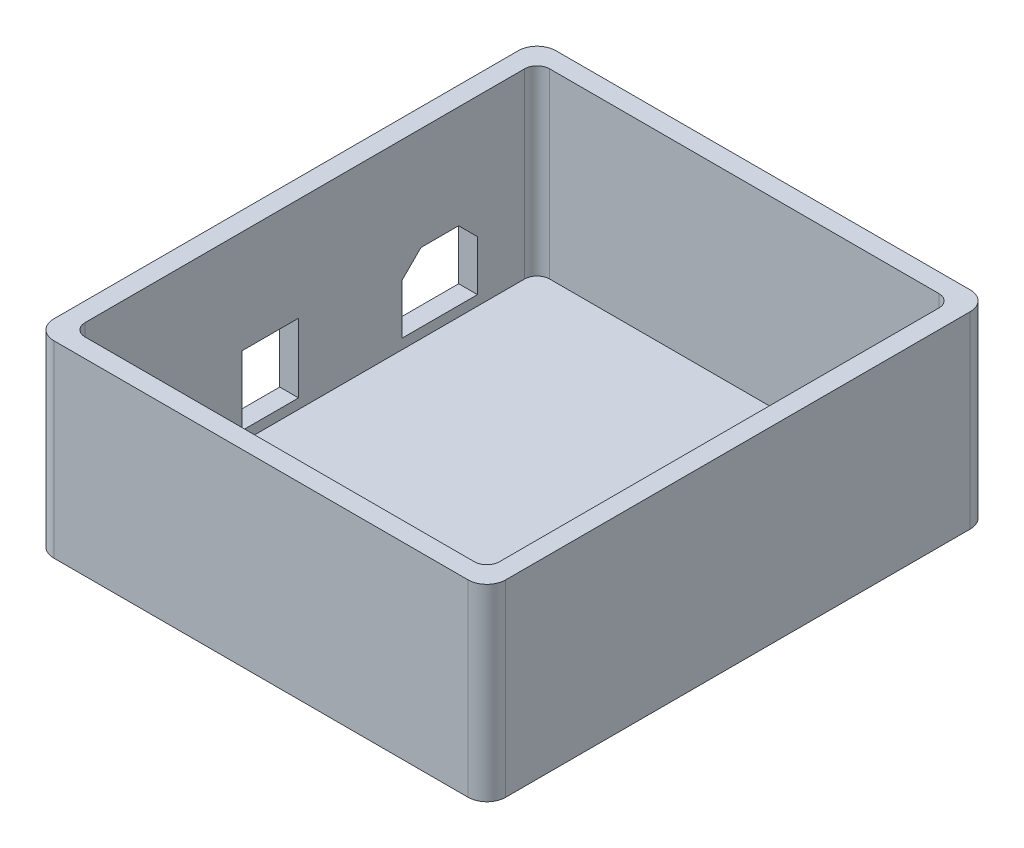
ISO-10303-21;
HEADER;
FILE_DESCRIPTION(('STEP AP214'),'2;1');
FILE_NAME('part.step','',(''),(''),'','','');
FILE_SCHEMA(('AUTOMOTIVE_DESIGN { 1 0 10303 214 1 1 1 1 }'));
ENDSEC;
DATA;
#1=APPLICATION_CONTEXT('core data for automotive mechanical design processes');
#2=APPLICATION_PROTOCOL_DEFINITION('international standard','automotive_design',2000,#1);
#3=PRODUCT_CONTEXT('',#1,'mechanical');
#4=PRODUCT('Part','Part','',(#3));
#5=PRODUCT_RELATED_PRODUCT_CATEGORY('part','',(#4));
#6=PRODUCT_DEFINITION_FORMATION('','',#4);
#7=PRODUCT_DEFINITION_CONTEXT('part definition',#1,'design');
#8=PRODUCT_DEFINITION('design','',#6,#7);
#9=PRODUCT_DEFINITION_SHAPE('','',#8);
#10=(LENGTH_UNIT() NAMED_UNIT(*) SI_UNIT(.MILLI.,.METRE.));
#11=(NAMED_UNIT(*) PLANE_ANGLE_UNIT() SI_UNIT($,.RADIAN.));
#12=(NAMED_UNIT(*) SI_UNIT($,.STERADIAN.) SOLID_ANGLE_UNIT());
#13=UNCERTAINTY_MEASURE_WITH_UNIT(LENGTH_MEASURE(1.E-05),#10,'distance_accuracy_value','');
#14=(GEOMETRIC_REPRESENTATION_CONTEXT(3) GLOBAL_UNCERTAINTY_ASSIGNED_CONTEXT((#13)) GLOBAL_UNIT_ASSIGNED_CONTEXT((#10,
#11,#12)) REPRESENTATION_CONTEXT('',''));
#15=CARTESIAN_POINT('',(0.,0.,0.));
#16=DIRECTION('',(0.,0.,1.));
#17=DIRECTION('',(1.,0.,0.));
#18=AXIS2_PLACEMENT_3D('',#15,#16,#17);
#19=CARTESIAN_POINT('',(-39.9773371104816,30.,-25.5552407932011));
#20=DIRECTION('',(1.,0.,0.));
#21=DIRECTION('',(0.,0.,-1.));
#22=AXIS2_PLACEMENT_3D('',#19,#20,#21);
#23=PLANE('',#22);
#24=DIRECTION('',(0.,-1.,0.));
#25=VECTOR('',#24,1.);
#26=CARTESIAN_POINT('',(-39.9773371104816,10.6,-16.0552407932011));
#27=LINE('',#26,#25);
#28=CARTESIAN_POINT('',(-39.9773371104816,10.6,-16.0552407932011));
#29=VERTEX_POINT('',#28);
#30=CARTESIAN_POINT('',(-39.9773371104816,2.6,-16.0552407932011));
#31=VERTEX_POINT('',#30);
#32=EDGE_CURVE('E244',#29,#31,#27,.T.);
#33=ORIENTED_EDGE('',*,*,#32,.F.);
#34=DIRECTION('',(0.,-0.706666118115189,-0.707547169811321));
#35=VECTOR('',#34,1.);
#36=CARTESIAN_POINT('',(-39.9773371104816,13.5962643408084,-13.0552407932011));
#37=LINE('',#36,#35);
#38=CARTESIAN_POINT('',(-39.9773371104816,13.5962643408084,-13.0552407932011));
#39=VERTEX_POINT('',#38);
#40=EDGE_CURVE('E50',#39,#29,#37,.T.);
#41=ORIENTED_EDGE('',*,*,#40,.F.);
#42=DIRECTION('',(0.,0.,-1.));
#43=VECTOR('',#42,1.);
#44=CARTESIAN_POINT('',(-39.9773371104816,13.5962643408084,-7.05524079320111));
#45=LINE('',#44,#43);
#46=CARTESIAN_POINT('',(-39.9773371104816,13.5962643408084,-7.05524079320111));
#47=VERTEX_POINT('',#46);
#48=EDGE_CURVE('E230',#47,#39,#45,.T.);
#49=ORIENTED_EDGE('',*,*,#48,.F.);
#50=DIRECTION('',(0.,0.706666118115189,-0.707547169811321));
#51=VECTOR('',#50,1.);
#52=CARTESIAN_POINT('',(-39.9773371104816,10.6,-4.05524079320111));
#53=LINE('',#52,#51);
#54=CARTESIAN_POINT('',(-39.9773371104816,10.6,-4.05524079320111));
#55=VERTEX_POINT('',#54);
#56=EDGE_CURVE('E233',#55,#47,#53,.T.);
#57=ORIENTED_EDGE('',*,*,#56,.F.);
#58=DIRECTION('',(0.,1.,0.));
#59=VECTOR('',#58,1.);
#60=CARTESIAN_POINT('',(-39.9773371104816,2.6,-4.05524079320111));
#61=LINE('',#60,#59);
#62=CARTESIAN_POINT('',(-39.9773371104816,2.6,-4.05524079320111));
#63=VERTEX_POINT('',#62);
#64=EDGE_CURVE('E250',#63,#55,#61,.T.);
#65=ORIENTED_EDGE('',*,*,#64,.F.);
#66=DIRECTION('',(0.,0.,1.));
#67=VECTOR('',#66,1.);
#68=CARTESIAN_POINT('',(-39.9773371104816,2.6,-16.0552407932011));
#69=LINE('',#68,#67);
#70=EDGE_CURVE('E247',#31,#63,#69,.T.);
#71=ORIENTED_EDGE('',*,*,#70,.F.);
#72=EDGE_LOOP('',(#33,#41,#49,#57,#65,#71));
#73=FACE_BOUND('',#72,.T.);
#74=DIRECTION('',(0.,0.,1.));
#75=VECTOR('',#74,1.);
#76=CARTESIAN_POINT('',(-39.9773371104816,2.6,12.4447592067989));
#77=LINE('',#76,#75);
#78=CARTESIAN_POINT('',(-39.9773371104816,2.6,12.4447592067989));
#79=VERTEX_POINT('',#78);
#80=CARTESIAN_POINT('',(-39.9773371104816,2.6,21.4447592067989));
#81=VERTEX_POINT('',#80);
#82=EDGE_CURVE('E280',#79,#81,#77,.T.);
#83=ORIENTED_EDGE('',*,*,#82,.F.);
#84=DIRECTION('',(0.,-1.,0.));
#85=VECTOR('',#84,1.);
#86=CARTESIAN_POINT('',(-39.9773371104816,13.6,12.4447592067989));
#87=LINE('',#86,#85);
#88=CARTESIAN_POINT('',(-39.9773371104816,13.6,12.4447592067989));
#89=VERTEX_POINT('',#88);
#90=EDGE_CURVE('E58',#89,#79,#87,.T.);
#91=ORIENTED_EDGE('',*,*,#90,.F.);
#92=DIRECTION('',(0.,0.,-1.));
#93=VECTOR('',#92,1.);
#94=CARTESIAN_POINT('',(-39.9773371104816,13.6,12.4447592067989));
#95=LINE('',#94,#93);
#96=CARTESIAN_POINT('',(-39.9773371104816,13.6,21.4447592067989));
#97=VERTEX_POINT('',#96);
#98=EDGE_CURVE('E269',#97,#89,#95,.T.);
#99=ORIENTED_EDGE('',*,*,#98,.F.);
#100=DIRECTION('',(0.,1.,0.));
#101=VECTOR('',#100,1.);
#102=CARTESIAN_POINT('',(-39.9773371104816,13.6,21.4447592067989));
#103=LINE('',#102,#101);
#104=EDGE_CURVE('E283',#81,#97,#103,.T.);
#105=ORIENTED_EDGE('',*,*,#104,.F.);
#106=EDGE_LOOP('',(#83,#91,#99,#105));
#107=FACE_BOUND('',#106,.T.);
#108=DIRECTION('',(0.,0.,1.));
#109=VECTOR('',#108,1.);
#110=CARTESIAN_POINT('',(-39.9773371104816,0.,-25.5552407932011));
#111=LINE('',#110,#109);
#112=CARTESIAN_POINT('',(-39.9773371104816,0.,-25.5552407932011));
#113=VERTEX_POINT('',#112);
#114=CARTESIAN_POINT('',(-39.9773371104816,0.,48.4447592067988));
#115=VERTEX_POINT('',#114);
#116=EDGE_CURVE('E362',#113,#115,#111,.T.);
#117=ORIENTED_EDGE('',*,*,#116,.T.);
#118=DIRECTION('',(0.,-1.,0.));
#119=VECTOR('',#118,1.);
#120=CARTESIAN_POINT('',(-39.9773371104816,30.,48.4447592067988));
#121=LINE('',#120,#119);
#122=CARTESIAN_POINT('',(-39.9773371104816,30.,48.4447592067988));
#123=VERTEX_POINT('',#122);
#124=EDGE_CURVE('E376',#123,#115,#121,.T.);
#125=ORIENTED_EDGE('',*,*,#124,.F.);
#126=DIRECTION('',(0.,0.,1.));
#127=VECTOR('',#126,1.);
#128=CARTESIAN_POINT('',(-39.9773371104816,30.,-25.5552407932011));
#129=LINE('',#128,#127);
#130=CARTESIAN_POINT('',(-39.9773371104816,30.,-25.5552407932011));
#131=VERTEX_POINT('',#130);
#132=EDGE_CURVE('E374',#131,#123,#129,.T.);
#133=ORIENTED_EDGE('',*,*,#132,.F.);
#134=DIRECTION('',(0.,-1.,0.));
#135=VECTOR('',#134,1.);
#136=CARTESIAN_POINT('',(-39.9773371104816,30.,-25.5552407932011));
#137=LINE('',#136,#135);
#138=EDGE_CURVE('E394',#131,#113,#137,.T.);
#139=ORIENTED_EDGE('',*,*,#138,.T.);
#140=EDGE_LOOP('',(#117,#125,#133,#139));
#141=FACE_BOUND('',#140,.T.);
#142=ADVANCED_FACE('F35',(#73,#107,#141),#23,.F.);
#143=CARTESIAN_POINT('',(-36.9773371104816,0.999999999999997,-23.5552407932011));
#144=DIRECTION('',(-1.,0.,0.));
#145=DIRECTION('',(0.,0.,1.));
#146=AXIS2_PLACEMENT_3D('',#143,#144,#145);
#147=PLANE('',#146);
#148=DIRECTION('',(0.,0.,-1.));
#149=VECTOR('',#148,1.);
#150=CARTESIAN_POINT('',(-36.9773371104816,13.5962643408084,-7.05524079320111));
#151=LINE('',#150,#149);
#152=CARTESIAN_POINT('',(-36.9773371104816,13.5962643408084,-7.05524079320111));
#153=VERTEX_POINT('',#152);
#154=CARTESIAN_POINT('',(-36.9773371104816,13.5962643408084,-13.0552407932011));
#155=VERTEX_POINT('',#154);
#156=EDGE_CURVE('E216',#153,#155,#151,.T.);
#157=ORIENTED_EDGE('',*,*,#156,.T.);
#158=DIRECTION('',(0.,-0.706666118115189,-0.707547169811321));
#159=VECTOR('',#158,1.);
#160=CARTESIAN_POINT('',(-36.9773371104816,13.5962643408084,-13.0552407932011));
#161=LINE('',#160,#159);
#162=CARTESIAN_POINT('',(-36.9773371104816,10.6,-16.0552407932011));
#163=VERTEX_POINT('',#162);
#164=EDGE_CURVE('E210',#155,#163,#161,.T.);
#165=ORIENTED_EDGE('',*,*,#164,.T.);
#166=DIRECTION('',(0.,-1.,0.));
#167=VECTOR('',#166,1.);
#168=CARTESIAN_POINT('',(-36.9773371104816,10.6,-16.0552407932011));
#169=LINE('',#168,#167);
#170=CARTESIAN_POINT('',(-36.9773371104816,2.6,-16.0552407932011));
#171=VERTEX_POINT('',#170);
#172=EDGE_CURVE('E220',#163,#171,#169,.T.);
#173=ORIENTED_EDGE('',*,*,#172,.T.);
#174=DIRECTION('',(0.,0.,1.));
#175=VECTOR('',#174,1.);
#176=CARTESIAN_POINT('',(-36.9773371104816,2.6,-16.0552407932011));
#177=LINE('',#176,#175);
#178=CARTESIAN_POINT('',(-36.9773371104816,2.6,-4.05524079320111));
#179=VERTEX_POINT('',#178);
#180=EDGE_CURVE('E224',#171,#179,#177,.T.);
#181=ORIENTED_EDGE('',*,*,#180,.T.);
#182=DIRECTION('',(0.,1.,0.));
#183=VECTOR('',#182,1.);
#184=CARTESIAN_POINT('',(-36.9773371104816,2.6,-4.05524079320111));
#185=LINE('',#184,#183);
#186=CARTESIAN_POINT('',(-36.9773371104816,10.6,-4.05524079320111));
#187=VERTEX_POINT('',#186);
#188=EDGE_CURVE('E237',#179,#187,#185,.T.);
#189=ORIENTED_EDGE('',*,*,#188,.T.);
#190=DIRECTION('',(0.,0.706666118115189,-0.707547169811321));
#191=VECTOR('',#190,1.);
#192=CARTESIAN_POINT('',(-36.9773371104816,10.6,-4.05524079320111));
#193=LINE('',#192,#191);
#194=EDGE_CURVE('E240',#187,#153,#193,.T.);
#195=ORIENTED_EDGE('',*,*,#194,.T.);
#196=EDGE_LOOP('',(#157,#165,#173,#181,#189,#195));
#197=FACE_BOUND('',#196,.T.);
#198=DIRECTION('',(0.,0.,-1.));
#199=VECTOR('',#198,1.);
#200=CARTESIAN_POINT('',(-36.9773371104816,13.6,12.4447592067989));
#201=LINE('',#200,#199);
#202=CARTESIAN_POINT('',(-36.9773371104816,13.6,21.4447592067989));
#203=VERTEX_POINT('',#202);
#204=CARTESIAN_POINT('',(-36.9773371104816,13.6,12.4447592067989));
#205=VERTEX_POINT('',#204);
#206=EDGE_CURVE('E275',#203,#205,#201,.T.);
#207=ORIENTED_EDGE('',*,*,#206,.T.);
#208=DIRECTION('',(0.,-1.,0.));
#209=VECTOR('',#208,1.);
#210=CARTESIAN_POINT('',(-36.9773371104816,13.6,12.4447592067989));
#211=LINE('',#210,#209);
#212=CARTESIAN_POINT('',(-36.9773371104816,2.6,12.4447592067989));
#213=VERTEX_POINT('',#212);
#214=EDGE_CURVE('E265',#205,#213,#211,.T.);
#215=ORIENTED_EDGE('',*,*,#214,.T.);
#216=DIRECTION('',(0.,0.,1.));
#217=VECTOR('',#216,1.);
#218=CARTESIAN_POINT('',(-36.9773371104816,2.6,12.4447592067989));
#219=LINE('',#218,#217);
#220=CARTESIAN_POINT('',(-36.9773371104816,2.6,21.4447592067989));
#221=VERTEX_POINT('',#220);
#222=EDGE_CURVE('E268',#213,#221,#219,.T.);
#223=ORIENTED_EDGE('',*,*,#222,.T.);
#224=DIRECTION('',(0.,1.,0.));
#225=VECTOR('',#224,1.);
#226=CARTESIAN_POINT('',(-36.9773371104816,13.6,21.4447592067989));
#227=LINE('',#226,#225);
#228=EDGE_CURVE('E272',#221,#203,#227,.T.);
#229=ORIENTED_EDGE('',*,*,#228,.T.);
#230=EDGE_LOOP('',(#207,#215,#223,#229));
#231=FACE_BOUND('',#230,.T.);
#232=DIRECTION('',(0.,0.,1.));
#233=VECTOR('',#232,1.);
#234=CARTESIAN_POINT('',(-36.9773371104816,30.,-23.5552407932011));
#235=LINE('',#234,#233);
#236=CARTESIAN_POINT('',(-36.9773371104816,30.,-23.5552407932011));
#237=VERTEX_POINT('',#236);
#238=CARTESIAN_POINT('',(-36.9773371104816,30.,46.4447592067988));
#239=VERTEX_POINT('',#238);
#240=EDGE_CURVE('E298',#237,#239,#235,.T.);
#241=ORIENTED_EDGE('',*,*,#240,.T.);
#242=DIRECTION('',(0.,1.,0.));
#243=VECTOR('',#242,1.);
#244=CARTESIAN_POINT('',(-36.9773371104816,0.999999999999997,46.4447592067988));
#245=LINE('',#244,#243);
#246=CARTESIAN_POINT('',(-36.9773371104816,0.999999999999997,46.4447592067988));
#247=VERTEX_POINT('',#246);
#248=EDGE_CURVE('E341',#247,#239,#245,.T.);
#249=ORIENTED_EDGE('',*,*,#248,.F.);
#250=DIRECTION('',(0.,0.,1.));
#251=VECTOR('',#250,1.);
#252=CARTESIAN_POINT('',(-36.9773371104816,0.999999999999997,-23.5552407932011));
#253=LINE('',#252,#251);
#254=CARTESIAN_POINT('',(-36.9773371104816,0.999999999999997,-23.5552407932011));
#255=VERTEX_POINT('',#254);
#256=EDGE_CURVE('E316',#255,#247,#253,.T.);
#257=ORIENTED_EDGE('',*,*,#256,.F.);
#258=DIRECTION('',(0.,1.,0.));
#259=VECTOR('',#258,1.);
#260=CARTESIAN_POINT('',(-36.9773371104816,0.999999999999997,-23.5552407932011));
#261=LINE('',#260,#259);
#262=EDGE_CURVE('E344',#255,#237,#261,.T.);
#263=ORIENTED_EDGE('',*,*,#262,.T.);
#264=EDGE_LOOP('',(#241,#249,#257,#263));
#265=FACE_BOUND('',#264,.T.);
#266=ADVANCED_FACE('F226',(#197,#231,#265),#147,.F.);
#267=CARTESIAN_POINT('',(-36.9773371104816,30.,48.4447592067989));
#268=DIRECTION('',(0.,-1.,0.));
#269=DIRECTION('',(0.,0.,-1.));
#270=AXIS2_PLACEMENT_3D('',#267,#268,#269);
#271=CYLINDRICAL_SURFACE('',#270,3.);
#272=CARTESIAN_POINT('',(-36.9773371104816,0.,48.4447592067989));
#273=DIRECTION('',(0.,1.,0.));
#274=DIRECTION('',(0.,0.,1.));
#275=AXIS2_PLACEMENT_3D('',#272,#273,#274);
#276=CIRCLE('',#275,3.);
#277=CARTESIAN_POINT('',(-36.9773371104816,0.,51.4447592067989));
#278=VERTEX_POINT('',#277);
#279=EDGE_CURVE('E343',#115,#278,#276,.T.);
#280=ORIENTED_EDGE('',*,*,#279,.T.);
#281=DIRECTION('',(0.,-1.,0.));
#282=VECTOR('',#281,1.);
#283=CARTESIAN_POINT('',(-36.9773371104816,30.,51.4447592067989));
#284=LINE('',#283,#282);
#285=CARTESIAN_POINT('',(-36.9773371104816,30.,51.4447592067989));
#286=VERTEX_POINT('',#285);
#287=EDGE_CURVE('E11',#286,#278,#284,.T.);
#288=ORIENTED_EDGE('',*,*,#287,.F.);
#289=CARTESIAN_POINT('',(-36.9773371104816,30.,48.4447592067989));
#290=DIRECTION('',(0.,1.,0.));
#291=DIRECTION('',(0.,0.,1.));
#292=AXIS2_PLACEMENT_3D('',#289,#290,#291);
#293=CIRCLE('',#292,3.);
#294=EDGE_CURVE('E358',#123,#286,#293,.T.);
#295=ORIENTED_EDGE('',*,*,#294,.F.);
#296=ORIENTED_EDGE('',*,*,#124,.T.);
#297=EDGE_LOOP('',(#280,#288,#295,#296));
#298=FACE_BOUND('',#297,.T.);
#299=ADVANCED_FACE('F37',(#298),#271,.T.);
#300=CARTESIAN_POINT('',(-36.9773371104816,30.,51.4447592067989));
#301=DIRECTION('',(0.,0.,-1.));
#302=DIRECTION('',(-1.,0.,0.));
#303=AXIS2_PLACEMENT_3D('',#300,#301,#302);
#304=PLANE('',#303);
#305=DIRECTION('',(1.,0.,0.));
#306=VECTOR('',#305,1.);
#307=CARTESIAN_POINT('',(-36.9773371104816,0.,51.4447592067989));
#308=LINE('',#307,#306);
#309=CARTESIAN_POINT('',(29.0226628895184,0.,51.4447592067989));
#310=VERTEX_POINT('',#309);
#311=EDGE_CURVE('E379',#278,#310,#308,.T.);
#312=ORIENTED_EDGE('',*,*,#311,.T.);
#313=DIRECTION('',(0.,-1.,0.));
#314=VECTOR('',#313,1.);
#315=CARTESIAN_POINT('',(29.0226628895184,30.,51.4447592067989));
#316=LINE('',#315,#314);
#317=CARTESIAN_POINT('',(29.0226628895184,30.,51.4447592067989));
#318=VERTEX_POINT('',#317);
#319=EDGE_CURVE('E43',#318,#310,#316,.T.);
#320=ORIENTED_EDGE('',*,*,#319,.F.);
#321=DIRECTION('',(1.,0.,0.));
#322=VECTOR('',#321,1.);
#323=CARTESIAN_POINT('',(-36.9773371104816,30.,51.4447592067989));
#324=LINE('',#323,#322);
#325=EDGE_CURVE('E361',#286,#318,#324,.T.);
#326=ORIENTED_EDGE('',*,*,#325,.F.);
#327=ORIENTED_EDGE('',*,*,#287,.T.);
#328=EDGE_LOOP('',(#312,#320,#326,#327));
#329=FACE_BOUND('',#328,.T.);
#330=ADVANCED_FACE('F436',(#329),#304,.F.);
#331=CARTESIAN_POINT('',(29.0226628895184,30.,48.4447592067989));
#332=DIRECTION('',(0.,-1.,0.));
#333=DIRECTION('',(0.,0.,-1.));
#334=AXIS2_PLACEMENT_3D('',#331,#332,#333);
#335=CYLINDRICAL_SURFACE('',#334,3.);
#336=CARTESIAN_POINT('',(29.0226628895184,0.,48.4447592067989));
#337=DIRECTION('',(0.,1.,0.));
#338=DIRECTION('',(0.,0.,1.));
#339=AXIS2_PLACEMENT_3D('',#336,#337,#338);
#340=CIRCLE('',#339,3.);
#341=CARTESIAN_POINT('',(32.0226628895184,0.,48.4447592067988));
#342=VERTEX_POINT('',#341);
#343=EDGE_CURVE('E381',#310,#342,#340,.T.);
#344=ORIENTED_EDGE('',*,*,#343,.T.);
#345=DIRECTION('',(0.,-1.,0.));
#346=VECTOR('',#345,1.);
#347=CARTESIAN_POINT('',(32.0226628895184,30.,48.4447592067988));
#348=LINE('',#347,#346);
#349=CARTESIAN_POINT('',(32.0226628895184,30.,48.4447592067988));
#350=VERTEX_POINT('',#349);
#351=EDGE_CURVE('E406',#350,#342,#348,.T.);
#352=ORIENTED_EDGE('',*,*,#351,.F.);
#353=CARTESIAN_POINT('',(29.0226628895184,30.,48.4447592067989));
#354=DIRECTION('',(0.,1.,0.));
#355=DIRECTION('',(0.,0.,1.));
#356=AXIS2_PLACEMENT_3D('',#353,#354,#355);
#357=CIRCLE('',#356,3.);
#358=EDGE_CURVE('E364',#318,#350,#357,.T.);
#359=ORIENTED_EDGE('',*,*,#358,.F.);
#360=ORIENTED_EDGE('',*,*,#319,.T.);
#361=EDGE_LOOP('',(#344,#352,#359,#360));
#362=FACE_BOUND('',#361,.T.);
#363=ADVANCED_FACE('F413',(#362),#335,.T.);
#364=CARTESIAN_POINT('',(32.0226628895184,30.,-25.5552407932011));
#365=DIRECTION('',(-1.,0.,0.));
#366=DIRECTION('',(0.,0.,1.));
#367=AXIS2_PLACEMENT_3D('',#364,#365,#366);
#368=PLANE('',#367);
#369=DIRECTION('',(0.,0.,-1.));
#370=VECTOR('',#369,1.);
#371=CARTESIAN_POINT('',(32.0226628895184,0.,-25.5552407932011));
#372=LINE('',#371,#370);
#373=CARTESIAN_POINT('',(32.0226628895184,0.,-25.5552407932011));
#374=VERTEX_POINT('',#373);
#375=EDGE_CURVE('E383',#342,#374,#372,.T.);
#376=ORIENTED_EDGE('',*,*,#375,.T.);
#377=DIRECTION('',(0.,-1.,0.));
#378=VECTOR('',#377,1.);
#379=CARTESIAN_POINT('',(32.0226628895184,30.,-25.5552407932011));
#380=LINE('',#379,#378);
#381=CARTESIAN_POINT('',(32.0226628895184,30.,-25.5552407932011));
#382=VERTEX_POINT('',#381);
#383=EDGE_CURVE('E403',#382,#374,#380,.T.);
#384=ORIENTED_EDGE('',*,*,#383,.F.);
#385=DIRECTION('',(0.,0.,-1.));
#386=VECTOR('',#385,1.);
#387=CARTESIAN_POINT('',(32.0226628895184,30.,-25.5552407932011));
#388=LINE('',#387,#386);
#389=EDGE_CURVE('E366',#350,#382,#388,.T.);
#390=ORIENTED_EDGE('',*,*,#389,.F.);
#391=ORIENTED_EDGE('',*,*,#351,.T.);
#392=EDGE_LOOP('',(#376,#384,#390,#391));
#393=FACE_BOUND('',#392,.T.);
#394=ADVANCED_FACE('F424',(#393),#368,.F.);
#395=CARTESIAN_POINT('',(29.0226628895184,30.,-25.5552407932011));
#396=DIRECTION('',(0.,-1.,0.));
#397=DIRECTION('',(0.,0.,-1.));
#398=AXIS2_PLACEMENT_3D('',#395,#396,#397);
#399=CYLINDRICAL_SURFACE('',#398,3.);
#400=CARTESIAN_POINT('',(29.0226628895184,0.,-25.5552407932011));
#401=DIRECTION('',(0.,1.,0.));
#402=DIRECTION('',(0.,0.,-1.));
#403=AXIS2_PLACEMENT_3D('',#400,#401,#402);
#404=CIRCLE('',#403,3.);
#405=CARTESIAN_POINT('',(29.0226628895184,0.,-28.5552407932011));
#406=VERTEX_POINT('',#405);
#407=EDGE_CURVE('E385',#374,#406,#404,.T.);
#408=ORIENTED_EDGE('',*,*,#407,.T.);
#409=DIRECTION('',(0.,-1.,0.));
#410=VECTOR('',#409,1.);
#411=CARTESIAN_POINT('',(29.0226628895184,30.,-28.5552407932011));
#412=LINE('',#411,#410);
#413=CARTESIAN_POINT('',(29.0226628895184,30.,-28.5552407932011));
#414=VERTEX_POINT('',#413);
#415=EDGE_CURVE('E400',#414,#406,#412,.T.);
#416=ORIENTED_EDGE('',*,*,#415,.F.);
#417=CARTESIAN_POINT('',(29.0226628895184,30.,-25.5552407932011));
#418=DIRECTION('',(0.,1.,0.));
#419=DIRECTION('',(0.,0.,-1.));
#420=AXIS2_PLACEMENT_3D('',#417,#418,#419);
#421=CIRCLE('',#420,3.);
#422=EDGE_CURVE('E368',#382,#414,#421,.T.);
#423=ORIENTED_EDGE('',*,*,#422,.F.);
#424=ORIENTED_EDGE('',*,*,#383,.T.);
#425=EDGE_LOOP('',(#408,#416,#423,#424));
#426=FACE_BOUND('',#425,.T.);
#427=ADVANCED_FACE('F428',(#426),#399,.T.);
#428=CARTESIAN_POINT('',(-36.9773371104816,30.,-28.5552407932011));
#429=DIRECTION('',(0.,0.,1.));
#430=DIRECTION('',(1.,0.,0.));
#431=AXIS2_PLACEMENT_3D('',#428,#429,#430);
#432=PLANE('',#431);
#433=DIRECTION('',(-1.,0.,0.));
#434=VECTOR('',#433,1.);
#435=CARTESIAN_POINT('',(-36.9773371104816,0.,-28.5552407932011));
#436=LINE('',#435,#434);
#437=CARTESIAN_POINT('',(-36.9773371104816,0.,-28.5552407932011));
#438=VERTEX_POINT('',#437);
#439=EDGE_CURVE('E387',#406,#438,#436,.T.);
#440=ORIENTED_EDGE('',*,*,#439,.T.);
#441=DIRECTION('',(0.,-1.,0.));
#442=VECTOR('',#441,1.);
#443=CARTESIAN_POINT('',(-36.9773371104816,30.,-28.5552407932011));
#444=LINE('',#443,#442);
#445=CARTESIAN_POINT('',(-36.9773371104816,30.,-28.5552407932011));
#446=VERTEX_POINT('',#445);
#447=EDGE_CURVE('E397',#446,#438,#444,.T.);
#448=ORIENTED_EDGE('',*,*,#447,.F.);
#449=DIRECTION('',(-1.,0.,0.));
#450=VECTOR('',#449,1.);
#451=CARTESIAN_POINT('',(-36.9773371104816,30.,-28.5552407932011));
#452=LINE('',#451,#450);
#453=EDGE_CURVE('E370',#414,#446,#452,.T.);
#454=ORIENTED_EDGE('',*,*,#453,.F.);
#455=ORIENTED_EDGE('',*,*,#415,.T.);
#456=EDGE_LOOP('',(#440,#448,#454,#455));
#457=FACE_BOUND('',#456,.T.);
#458=ADVANCED_FACE('F448',(#457),#432,.F.);
#459=CARTESIAN_POINT('',(-36.9773371104816,30.,-25.5552407932011));
#460=DIRECTION('',(0.,-1.,0.));
#461=DIRECTION('',(0.,0.,-1.));
#462=AXIS2_PLACEMENT_3D('',#459,#460,#461);
#463=CYLINDRICAL_SURFACE('',#462,3.);
#464=CARTESIAN_POINT('',(-36.9773371104816,0.,-25.5552407932011));
#465=DIRECTION('',(0.,1.,0.));
#466=DIRECTION('',(0.,0.,1.));
#467=AXIS2_PLACEMENT_3D('',#464,#465,#466);
#468=CIRCLE('',#467,3.);
#469=EDGE_CURVE('E389',#438,#113,#468,.T.);
#470=ORIENTED_EDGE('',*,*,#469,.T.);
#471=ORIENTED_EDGE('',*,*,#138,.F.);
#472=CARTESIAN_POINT('',(-36.9773371104816,30.,-25.5552407932011));
#473=DIRECTION('',(0.,1.,0.));
#474=DIRECTION('',(0.,0.,1.));
#475=AXIS2_PLACEMENT_3D('',#472,#473,#474);
#476=CIRCLE('',#475,3.);
#477=EDGE_CURVE('E372',#446,#131,#476,.T.);
#478=ORIENTED_EDGE('',*,*,#477,.F.);
#479=ORIENTED_EDGE('',*,*,#447,.T.);
#480=EDGE_LOOP('',(#470,#471,#478,#479));
#481=FACE_BOUND('',#480,.T.);
#482=ADVANCED_FACE('F446',(#481),#463,.T.);
#483=CARTESIAN_POINT('',(-36.9773371104816,30.,48.4447592067989));
#484=DIRECTION('',(0.,1.,0.));
#485=DIRECTION('',(0.,0.,1.));
#486=AXIS2_PLACEMENT_3D('',#483,#484,#485);
#487=PLANE('',#486);
#488=CARTESIAN_POINT('',(-34.9773371104816,30.,46.4447592067989));
#489=DIRECTION('',(0.,1.,0.));
#490=DIRECTION('',(0.,0.,1.));
#491=AXIS2_PLACEMENT_3D('',#488,#489,#490);
#492=CIRCLE('',#491,2.);
#493=CARTESIAN_POINT('',(-34.9773371104816,30.,48.4447592067989));
#494=VERTEX_POINT('',#493);
#495=EDGE_CURVE('E257',#239,#494,#492,.T.);
#496=ORIENTED_EDGE('',*,*,#495,.F.);
#497=ORIENTED_EDGE('',*,*,#240,.F.);
#498=CARTESIAN_POINT('',(-34.9773371104816,30.,-23.5552407932011));
#499=DIRECTION('',(0.,1.,0.));
#500=DIRECTION('',(0.,0.,1.));
#501=AXIS2_PLACEMENT_3D('',#498,#499,#500);
#502=CIRCLE('',#501,2.);
#503=CARTESIAN_POINT('',(-34.9773371104816,30.,-25.5552407932011));
#504=VERTEX_POINT('',#503);
#505=EDGE_CURVE('E336',#504,#237,#502,.T.);
#506=ORIENTED_EDGE('',*,*,#505,.F.);
#507=DIRECTION('',(-1.,0.,0.));
#508=VECTOR('',#507,1.);
#509=CARTESIAN_POINT('',(-34.9773371104816,30.,-25.5552407932011));
#510=LINE('',#509,#508);
#511=CARTESIAN_POINT('',(27.0226628895184,30.,-25.5552407932011));
#512=VERTEX_POINT('',#511);
#513=EDGE_CURVE('E333',#512,#504,#510,.T.);
#514=ORIENTED_EDGE('',*,*,#513,.F.);
#515=CARTESIAN_POINT('',(27.0226628895184,30.,-23.5552407932011));
#516=DIRECTION('',(0.,1.,0.));
#517=DIRECTION('',(0.,0.,-1.));
#518=AXIS2_PLACEMENT_3D('',#515,#516,#517);
#519=CIRCLE('',#518,2.);
#520=CARTESIAN_POINT('',(29.0226628895184,30.,-23.5552407932011));
#521=VERTEX_POINT('',#520);
#522=EDGE_CURVE('E330',#521,#512,#519,.T.);
#523=ORIENTED_EDGE('',*,*,#522,.F.);
#524=DIRECTION('',(0.,0.,-1.));
#525=VECTOR('',#524,1.);
#526=CARTESIAN_POINT('',(29.0226628895184,30.,-23.5552407932011));
#527=LINE('',#526,#525);
#528=CARTESIAN_POINT('',(29.0226628895184,30.,46.4447592067988));
#529=VERTEX_POINT('',#528);
#530=EDGE_CURVE('E327',#529,#521,#527,.T.);
#531=ORIENTED_EDGE('',*,*,#530,.F.);
#532=CARTESIAN_POINT('',(27.0226628895184,30.,46.4447592067989));
#533=DIRECTION('',(0.,1.,0.));
#534=DIRECTION('',(0.,0.,1.));
#535=AXIS2_PLACEMENT_3D('',#532,#533,#534);
#536=CIRCLE('',#535,2.);
#537=CARTESIAN_POINT('',(27.0226628895184,30.,48.4447592067989));
#538=VERTEX_POINT('',#537);
#539=EDGE_CURVE('E324',#538,#529,#536,.T.);
#540=ORIENTED_EDGE('',*,*,#539,.F.);
#541=DIRECTION('',(1.,0.,0.));
#542=VECTOR('',#541,1.);
#543=CARTESIAN_POINT('',(-34.9773371104816,30.,48.4447592067989));
#544=LINE('',#543,#542);
#545=EDGE_CURVE('E321',#494,#538,#544,.T.);
#546=ORIENTED_EDGE('',*,*,#545,.F.);
#547=EDGE_LOOP('',(#496,#497,#506,#514,#523,#531,#540,#546));
#548=FACE_BOUND('',#547,.T.);
#549=ORIENTED_EDGE('',*,*,#294,.T.);
#550=ORIENTED_EDGE('',*,*,#325,.T.);
#551=ORIENTED_EDGE('',*,*,#358,.T.);
#552=ORIENTED_EDGE('',*,*,#389,.T.);
#553=ORIENTED_EDGE('',*,*,#422,.T.);
#554=ORIENTED_EDGE('',*,*,#453,.T.);
#555=ORIENTED_EDGE('',*,*,#477,.T.);
#556=ORIENTED_EDGE('',*,*,#132,.T.);
#557=EDGE_LOOP('',(#549,#550,#551,#552,#553,#554,#555,#556));
#558=FACE_BOUND('',#557,.T.);
#559=ADVANCED_FACE('F432',(#548,#558),#487,.T.);
#560=CARTESIAN_POINT('',(-36.9773371104816,0.,48.4447592067989));
#561=DIRECTION('',(0.,1.,0.));
#562=DIRECTION('',(0.,0.,1.));
#563=AXIS2_PLACEMENT_3D('',#560,#561,#562);
#564=PLANE('',#563);
#565=ORIENTED_EDGE('',*,*,#279,.F.);
#566=ORIENTED_EDGE('',*,*,#116,.F.);
#567=ORIENTED_EDGE('',*,*,#469,.F.);
#568=ORIENTED_EDGE('',*,*,#439,.F.);
#569=ORIENTED_EDGE('',*,*,#407,.F.);
#570=ORIENTED_EDGE('',*,*,#375,.F.);
#571=ORIENTED_EDGE('',*,*,#343,.F.);
#572=ORIENTED_EDGE('',*,*,#311,.F.);
#573=EDGE_LOOP('',(#565,#566,#567,#568,#569,#570,#571,#572));
#574=FACE_BOUND('',#573,.T.);
#575=ADVANCED_FACE('F419',(#574),#564,.F.);
#576=CARTESIAN_POINT('',(-34.9773371104816,0.999999999999997,46.4447592067989));
#577=DIRECTION('',(0.,1.,0.));
#578=DIRECTION('',(0.,0.,1.));
#579=AXIS2_PLACEMENT_3D('',#576,#577,#578);
#580=CYLINDRICAL_SURFACE('',#579,2.);
#581=ORIENTED_EDGE('',*,*,#495,.T.);
#582=DIRECTION('',(0.,1.,0.));
#583=VECTOR('',#582,1.);
#584=CARTESIAN_POINT('',(-34.9773371104816,0.999999999999997,48.4447592067989));
#585=LINE('',#584,#583);
#586=CARTESIAN_POINT('',(-34.9773371104816,0.999999999999997,48.4447592067989));
#587=VERTEX_POINT('',#586);
#588=EDGE_CURVE('E319',#587,#494,#585,.T.);
#589=ORIENTED_EDGE('',*,*,#588,.F.);
#590=CARTESIAN_POINT('',(-34.9773371104816,0.999999999999997,46.4447592067989));
#591=DIRECTION('',(0.,1.,0.));
#592=DIRECTION('',(0.,0.,1.));
#593=AXIS2_PLACEMENT_3D('',#590,#591,#592);
#594=CIRCLE('',#593,2.);
#595=EDGE_CURVE('E294',#247,#587,#594,.T.);
#596=ORIENTED_EDGE('',*,*,#595,.F.);
#597=ORIENTED_EDGE('',*,*,#248,.T.);
#598=EDGE_LOOP('',(#581,#589,#596,#597));
#599=FACE_BOUND('',#598,.T.);
#600=ADVANCED_FACE('F468',(#599),#580,.F.);
#601=CARTESIAN_POINT('',(-34.9773371104816,0.999999999999997,-23.5552407932011));
#602=DIRECTION('',(0.,1.,0.));
#603=DIRECTION('',(0.,0.,1.));
#604=AXIS2_PLACEMENT_3D('',#601,#602,#603);
#605=CYLINDRICAL_SURFACE('',#604,2.);
#606=ORIENTED_EDGE('',*,*,#505,.T.);
#607=ORIENTED_EDGE('',*,*,#262,.F.);
#608=CARTESIAN_POINT('',(-34.9773371104816,0.999999999999997,-23.5552407932011));
#609=DIRECTION('',(0.,1.,0.));
#610=DIRECTION('',(0.,0.,1.));
#611=AXIS2_PLACEMENT_3D('',#608,#609,#610);
#612=CIRCLE('',#611,2.);
#613=CARTESIAN_POINT('',(-34.9773371104816,0.999999999999997,-25.5552407932011));
#614=VERTEX_POINT('',#613);
#615=EDGE_CURVE('E313',#614,#255,#612,.T.);
#616=ORIENTED_EDGE('',*,*,#615,.F.);
#617=DIRECTION('',(0.,1.,0.));
#618=VECTOR('',#617,1.);
#619=CARTESIAN_POINT('',(-34.9773371104816,0.999999999999997,-25.5552407932011));
#620=LINE('',#619,#618);
#621=EDGE_CURVE('E346',#614,#504,#620,.T.);
#622=ORIENTED_EDGE('',*,*,#621,.T.);
#623=EDGE_LOOP('',(#606,#607,#616,#622));
#624=FACE_BOUND('',#623,.T.);
#625=ADVANCED_FACE('F474',(#624),#605,.F.);
#626=CARTESIAN_POINT('',(-34.9773371104816,0.999999999999997,-25.5552407932011));
#627=DIRECTION('',(0.,0.,-1.));
#628=DIRECTION('',(-1.,0.,0.));
#629=AXIS2_PLACEMENT_3D('',#626,#627,#628);
#630=PLANE('',#629);
#631=ORIENTED_EDGE('',*,*,#513,.T.);
#632=ORIENTED_EDGE('',*,*,#621,.F.);
#633=DIRECTION('',(-1.,0.,0.));
#634=VECTOR('',#633,1.);
#635=CARTESIAN_POINT('',(-34.9773371104816,0.999999999999997,-25.5552407932011));
#636=LINE('',#635,#634);
#637=CARTESIAN_POINT('',(27.0226628895184,0.999999999999997,-25.5552407932011));
#638=VERTEX_POINT('',#637);
#639=EDGE_CURVE('E310',#638,#614,#636,.T.);
#640=ORIENTED_EDGE('',*,*,#639,.F.);
#641=DIRECTION('',(0.,1.,0.));
#642=VECTOR('',#641,1.);
#643=CARTESIAN_POINT('',(27.0226628895184,0.999999999999997,-25.5552407932011));
#644=LINE('',#643,#642);
#645=EDGE_CURVE('E348',#638,#512,#644,.T.);
#646=ORIENTED_EDGE('',*,*,#645,.T.);
#647=EDGE_LOOP('',(#631,#632,#640,#646));
#648=FACE_BOUND('',#647,.T.);
#649=ADVANCED_FACE('F492',(#648),#630,.F.);
#650=CARTESIAN_POINT('',(27.0226628895184,0.999999999999997,-23.5552407932011));
#651=DIRECTION('',(0.,1.,0.));
#652=DIRECTION('',(0.,0.,1.));
#653=AXIS2_PLACEMENT_3D('',#650,#651,#652);
#654=CYLINDRICAL_SURFACE('',#653,2.);
#655=ORIENTED_EDGE('',*,*,#522,.T.);
#656=ORIENTED_EDGE('',*,*,#645,.F.);
#657=CARTESIAN_POINT('',(27.0226628895184,0.999999999999997,-23.5552407932011));
#658=DIRECTION('',(0.,1.,0.));
#659=DIRECTION('',(0.,0.,-1.));
#660=AXIS2_PLACEMENT_3D('',#657,#658,#659);
#661=CIRCLE('',#660,2.);
#662=CARTESIAN_POINT('',(29.0226628895184,0.999999999999997,-23.5552407932011));
#663=VERTEX_POINT('',#662);
#664=EDGE_CURVE('E307',#663,#638,#661,.T.);
#665=ORIENTED_EDGE('',*,*,#664,.F.);
#666=DIRECTION('',(0.,1.,0.));
#667=VECTOR('',#666,1.);
#668=CARTESIAN_POINT('',(29.0226628895184,0.999999999999997,-23.5552407932011));
#669=LINE('',#668,#667);
#670=EDGE_CURVE('E350',#663,#521,#669,.T.);
#671=ORIENTED_EDGE('',*,*,#670,.T.);
#672=EDGE_LOOP('',(#655,#656,#665,#671));
#673=FACE_BOUND('',#672,.T.);
#674=ADVANCED_FACE('F488',(#673),#654,.F.);
#675=CARTESIAN_POINT('',(29.0226628895184,0.999999999999997,-23.5552407932011));
#676=DIRECTION('',(1.,0.,0.));
#677=DIRECTION('',(0.,0.,-1.));
#678=AXIS2_PLACEMENT_3D('',#675,#676,#677);
#679=PLANE('',#678);
#680=ORIENTED_EDGE('',*,*,#530,.T.);
#681=ORIENTED_EDGE('',*,*,#670,.F.);
#682=DIRECTION('',(0.,0.,-1.));
#683=VECTOR('',#682,1.);
#684=CARTESIAN_POINT('',(29.0226628895184,0.999999999999997,-23.5552407932011));
#685=LINE('',#684,#683);
#686=CARTESIAN_POINT('',(29.0226628895184,0.999999999999997,46.4447592067988));
#687=VERTEX_POINT('',#686);
#688=EDGE_CURVE('E304',#687,#663,#685,.T.);
#689=ORIENTED_EDGE('',*,*,#688,.F.);
#690=DIRECTION('',(0.,1.,0.));
#691=VECTOR('',#690,1.);
#692=CARTESIAN_POINT('',(29.0226628895184,0.999999999999997,46.4447592067988));
#693=LINE('',#692,#691);
#694=EDGE_CURVE('E352',#687,#529,#693,.T.);
#695=ORIENTED_EDGE('',*,*,#694,.T.);
#696=EDGE_LOOP('',(#680,#681,#689,#695));
#697=FACE_BOUND('',#696,.T.);
#698=ADVANCED_FACE('F484',(#697),#679,.F.);
#699=CARTESIAN_POINT('',(27.0226628895184,0.999999999999997,46.4447592067989));
#700=DIRECTION('',(0.,1.,0.));
#701=DIRECTION('',(0.,0.,1.));
#702=AXIS2_PLACEMENT_3D('',#699,#700,#701);
#703=CYLINDRICAL_SURFACE('',#702,2.);
#704=ORIENTED_EDGE('',*,*,#539,.T.);
#705=ORIENTED_EDGE('',*,*,#694,.F.);
#706=CARTESIAN_POINT('',(27.0226628895184,0.999999999999997,46.4447592067989));
#707=DIRECTION('',(0.,1.,0.));
#708=DIRECTION('',(0.,0.,1.));
#709=AXIS2_PLACEMENT_3D('',#706,#707,#708);
#710=CIRCLE('',#709,2.);
#711=CARTESIAN_POINT('',(27.0226628895184,0.999999999999997,48.4447592067989));
#712=VERTEX_POINT('',#711);
#713=EDGE_CURVE('E301',#712,#687,#710,.T.);
#714=ORIENTED_EDGE('',*,*,#713,.F.);
#715=DIRECTION('',(0.,1.,0.));
#716=VECTOR('',#715,1.);
#717=CARTESIAN_POINT('',(27.0226628895184,0.999999999999997,48.4447592067989));
#718=LINE('',#717,#716);
#719=EDGE_CURVE('E354',#712,#538,#718,.T.);
#720=ORIENTED_EDGE('',*,*,#719,.T.);
#721=EDGE_LOOP('',(#704,#705,#714,#720));
#722=FACE_BOUND('',#721,.T.);
#723=ADVANCED_FACE('F480',(#722),#703,.F.);
#724=CARTESIAN_POINT('',(-34.9773371104816,0.999999999999997,48.4447592067989));
#725=DIRECTION('',(0.,0.,1.));
#726=DIRECTION('',(1.,0.,0.));
#727=AXIS2_PLACEMENT_3D('',#724,#725,#726);
#728=PLANE('',#727);
#729=ORIENTED_EDGE('',*,*,#545,.T.);
#730=ORIENTED_EDGE('',*,*,#719,.F.);
#731=DIRECTION('',(1.,0.,0.));
#732=VECTOR('',#731,1.);
#733=CARTESIAN_POINT('',(-34.9773371104816,0.999999999999997,48.4447592067989));
#734=LINE('',#733,#732);
#735=EDGE_CURVE('E297',#587,#712,#734,.T.);
#736=ORIENTED_EDGE('',*,*,#735,.F.);
#737=ORIENTED_EDGE('',*,*,#588,.T.);
#738=EDGE_LOOP('',(#729,#730,#736,#737));
#739=FACE_BOUND('',#738,.T.);
#740=ADVANCED_FACE('F476',(#739),#728,.F.);
#741=CARTESIAN_POINT('',(-34.9773371104816,0.999999999999997,46.4447592067989));
#742=DIRECTION('',(0.,1.,0.));
#743=DIRECTION('',(0.,0.,1.));
#744=AXIS2_PLACEMENT_3D('',#741,#742,#743);
#745=PLANE('',#744);
#746=ORIENTED_EDGE('',*,*,#595,.T.);
#747=ORIENTED_EDGE('',*,*,#735,.T.);
#748=ORIENTED_EDGE('',*,*,#713,.T.);
#749=ORIENTED_EDGE('',*,*,#688,.T.);
#750=ORIENTED_EDGE('',*,*,#664,.T.);
#751=ORIENTED_EDGE('',*,*,#639,.T.);
#752=ORIENTED_EDGE('',*,*,#615,.T.);
#753=ORIENTED_EDGE('',*,*,#256,.T.);
#754=EDGE_LOOP('',(#746,#747,#748,#749,#750,#751,#752,#753));
#755=FACE_BOUND('',#754,.T.);
#756=ADVANCED_FACE('F479',(#755),#745,.T.);
#757=CARTESIAN_POINT('',(-36.9773371104816,13.6,12.4447592067989));
#758=DIRECTION('',(0.,0.,-1.));
#759=DIRECTION('',(-1.,0.,0.));
#760=AXIS2_PLACEMENT_3D('',#757,#758,#759);
#761=PLANE('',#760);
#762=ORIENTED_EDGE('',*,*,#90,.T.);
#763=DIRECTION('',(-1.,0.,0.));
#764=VECTOR('',#763,1.);
#765=CARTESIAN_POINT('',(-36.9773371104816,2.6,12.4447592067989));
#766=LINE('',#765,#764);
#767=EDGE_CURVE('E278',#213,#79,#766,.T.);
#768=ORIENTED_EDGE('',*,*,#767,.F.);
#769=ORIENTED_EDGE('',*,*,#214,.F.);
#770=DIRECTION('',(-1.,0.,0.));
#771=VECTOR('',#770,1.);
#772=CARTESIAN_POINT('',(-36.9773371104816,13.6,12.4447592067989));
#773=LINE('',#772,#771);
#774=EDGE_CURVE('E245',#205,#89,#773,.T.);
#775=ORIENTED_EDGE('',*,*,#774,.T.);
#776=EDGE_LOOP('',(#762,#768,#769,#775));
#777=FACE_BOUND('',#776,.T.);
#778=ADVANCED_FACE('F502',(#777),#761,.F.);
#779=CARTESIAN_POINT('',(-36.9773371104816,13.6,12.4447592067989));
#780=DIRECTION('',(0.,1.,0.));
#781=DIRECTION('',(0.,0.,1.));
#782=AXIS2_PLACEMENT_3D('',#779,#780,#781);
#783=PLANE('',#782);
#784=ORIENTED_EDGE('',*,*,#98,.T.);
#785=ORIENTED_EDGE('',*,*,#774,.F.);
#786=ORIENTED_EDGE('',*,*,#206,.F.);
#787=DIRECTION('',(-1.,0.,0.));
#788=VECTOR('',#787,1.);
#789=CARTESIAN_POINT('',(-36.9773371104816,13.6,21.4447592067989));
#790=LINE('',#789,#788);
#791=EDGE_CURVE('E289',#203,#97,#790,.T.);
#792=ORIENTED_EDGE('',*,*,#791,.T.);
#793=EDGE_LOOP('',(#784,#785,#786,#792));
#794=FACE_BOUND('',#793,.T.);
#795=ADVANCED_FACE('F506',(#794),#783,.F.);
#796=CARTESIAN_POINT('',(-36.9773371104816,13.6,21.4447592067989));
#797=DIRECTION('',(0.,0.,1.));
#798=DIRECTION('',(1.,0.,0.));
#799=AXIS2_PLACEMENT_3D('',#796,#797,#798);
#800=PLANE('',#799);
#801=ORIENTED_EDGE('',*,*,#104,.T.);
#802=ORIENTED_EDGE('',*,*,#791,.F.);
#803=ORIENTED_EDGE('',*,*,#228,.F.);
#804=DIRECTION('',(-1.,0.,0.));
#805=VECTOR('',#804,1.);
#806=CARTESIAN_POINT('',(-36.9773371104816,2.6,21.4447592067989));
#807=LINE('',#806,#805);
#808=EDGE_CURVE('E291',#221,#81,#807,.T.);
#809=ORIENTED_EDGE('',*,*,#808,.T.);
#810=EDGE_LOOP('',(#801,#802,#803,#809));
#811=FACE_BOUND('',#810,.T.);
#812=ADVANCED_FACE('F510',(#811),#800,.F.);
#813=CARTESIAN_POINT('',(-36.9773371104816,2.6,12.4447592067989));
#814=DIRECTION('',(0.,-1.,0.));
#815=DIRECTION('',(0.,0.,-1.));
#816=AXIS2_PLACEMENT_3D('',#813,#814,#815);
#817=PLANE('',#816);
#818=ORIENTED_EDGE('',*,*,#82,.T.);
#819=ORIENTED_EDGE('',*,*,#808,.F.);
#820=ORIENTED_EDGE('',*,*,#222,.F.);
#821=ORIENTED_EDGE('',*,*,#767,.T.);
#822=EDGE_LOOP('',(#818,#819,#820,#821));
#823=FACE_BOUND('',#822,.T.);
#824=ADVANCED_FACE('F507',(#823),#817,.F.);
#825=CARTESIAN_POINT('',(-36.9773371104816,13.5962643408084,-13.0552407932011));
#826=DIRECTION('',(0.,0.707547169811321,-0.706666118115189));
#827=DIRECTION('',(0.,0.706666118115189,0.707547169811321));
#828=AXIS2_PLACEMENT_3D('',#825,#826,#827);
#829=PLANE('',#828);
#830=ORIENTED_EDGE('',*,*,#40,.T.);
#831=DIRECTION('',(-1.,0.,0.));
#832=VECTOR('',#831,1.);
#833=CARTESIAN_POINT('',(-36.9773371104816,10.6,-16.0552407932011));
#834=LINE('',#833,#832);
#835=EDGE_CURVE('E206',#163,#29,#834,.T.);
#836=ORIENTED_EDGE('',*,*,#835,.F.);
#837=ORIENTED_EDGE('',*,*,#164,.F.);
#838=DIRECTION('',(-1.,0.,0.));
#839=VECTOR('',#838,1.);
#840=CARTESIAN_POINT('',(-36.9773371104816,13.5962643408084,-13.0552407932011));
#841=LINE('',#840,#839);
#842=EDGE_CURVE('E255',#155,#39,#841,.T.);
#843=ORIENTED_EDGE('',*,*,#842,.T.);
#844=EDGE_LOOP('',(#830,#836,#837,#843));
#845=FACE_BOUND('',#844,.T.);
#846=ADVANCED_FACE('F208',(#845),#829,.F.);
#847=CARTESIAN_POINT('',(-36.9773371104816,13.5962643408084,-7.05524079320111));
#848=DIRECTION('',(0.,1.,0.));
#849=DIRECTION('',(0.,0.,1.));
#850=AXIS2_PLACEMENT_3D('',#847,#848,#849);
#851=PLANE('',#850);
#852=ORIENTED_EDGE('',*,*,#48,.T.);
#853=ORIENTED_EDGE('',*,*,#842,.F.);
#854=ORIENTED_EDGE('',*,*,#156,.F.);
#855=DIRECTION('',(-1.,0.,0.));
#856=VECTOR('',#855,1.);
#857=CARTESIAN_POINT('',(-36.9773371104816,13.5962643408084,-7.05524079320111));
#858=LINE('',#857,#856);
#859=EDGE_CURVE('E258',#153,#47,#858,.T.);
#860=ORIENTED_EDGE('',*,*,#859,.T.);
#861=EDGE_LOOP('',(#852,#853,#854,#860));
#862=FACE_BOUND('',#861,.T.);
#863=ADVANCED_FACE('F520',(#862),#851,.F.);
#864=CARTESIAN_POINT('',(-36.9773371104816,10.6,-4.05524079320111));
#865=DIRECTION('',(0.,0.707547169811321,0.706666118115189));
#866=DIRECTION('',(0.,-0.706666118115189,0.707547169811321));
#867=AXIS2_PLACEMENT_3D('',#864,#865,#866);
#868=PLANE('',#867);
#869=ORIENTED_EDGE('',*,*,#56,.T.);
#870=ORIENTED_EDGE('',*,*,#859,.F.);
#871=ORIENTED_EDGE('',*,*,#194,.F.);
#872=DIRECTION('',(-1.,0.,0.));
#873=VECTOR('',#872,1.);
#874=CARTESIAN_POINT('',(-36.9773371104816,10.6,-4.05524079320111));
#875=LINE('',#874,#873);
#876=EDGE_CURVE('E260',#187,#55,#875,.T.);
#877=ORIENTED_EDGE('',*,*,#876,.T.);
#878=EDGE_LOOP('',(#869,#870,#871,#877));
#879=FACE_BOUND('',#878,.T.);
#880=ADVANCED_FACE('F530',(#879),#868,.F.);
#881=CARTESIAN_POINT('',(-36.9773371104816,2.6,-4.05524079320111));
#882=DIRECTION('',(0.,0.,1.));
#883=DIRECTION('',(0.,-1.,0.));
#884=AXIS2_PLACEMENT_3D('',#881,#882,#883);
#885=PLANE('',#884);
#886=ORIENTED_EDGE('',*,*,#64,.T.);
#887=ORIENTED_EDGE('',*,*,#876,.F.);
#888=ORIENTED_EDGE('',*,*,#188,.F.);
#889=DIRECTION('',(-1.,0.,0.));
#890=VECTOR('',#889,1.);
#891=CARTESIAN_POINT('',(-36.9773371104816,2.6,-4.05524079320111));
#892=LINE('',#891,#890);
#893=EDGE_CURVE('E262',#179,#63,#892,.T.);
#894=ORIENTED_EDGE('',*,*,#893,.T.);
#895=EDGE_LOOP('',(#886,#887,#888,#894));
#896=FACE_BOUND('',#895,.T.);
#897=ADVANCED_FACE('F526',(#896),#885,.F.);
#898=CARTESIAN_POINT('',(-36.9773371104816,2.6,-16.0552407932011));
#899=DIRECTION('',(0.,-1.,0.));
#900=DIRECTION('',(0.,0.,-1.));
#901=AXIS2_PLACEMENT_3D('',#898,#899,#900);
#902=PLANE('',#901);
#903=ORIENTED_EDGE('',*,*,#70,.T.);
#904=ORIENTED_EDGE('',*,*,#893,.F.);
#905=ORIENTED_EDGE('',*,*,#180,.F.);
#906=DIRECTION('',(-1.,0.,0.));
#907=VECTOR('',#906,1.);
#908=CARTESIAN_POINT('',(-36.9773371104816,2.6,-16.0552407932011));
#909=LINE('',#908,#907);
#910=EDGE_CURVE('E215',#171,#31,#909,.T.);
#911=ORIENTED_EDGE('',*,*,#910,.T.);
#912=EDGE_LOOP('',(#903,#904,#905,#911));
#913=FACE_BOUND('',#912,.T.);
#914=ADVANCED_FACE('F523',(#913),#902,.F.);
#915=CARTESIAN_POINT('',(-36.9773371104816,10.6,-16.0552407932011));
#916=DIRECTION('',(0.,0.,-1.));
#917=DIRECTION('',(-1.,0.,0.));
#918=AXIS2_PLACEMENT_3D('',#915,#916,#917);
#919=PLANE('',#918);
#920=ORIENTED_EDGE('',*,*,#32,.T.);
#921=ORIENTED_EDGE('',*,*,#910,.F.);
#922=ORIENTED_EDGE('',*,*,#172,.F.);
#923=ORIENTED_EDGE('',*,*,#835,.T.);
#924=EDGE_LOOP('',(#920,#921,#922,#923));
#925=FACE_BOUND('',#924,.T.);
#926=ADVANCED_FACE('F221',(#925),#919,.F.);
#927=CLOSED_SHELL('',(#142,#266,#299,#330,#363,#394,#427,#458,#482,#559,#575,#600,#625,#649,
#674,#698,#723,#740,#756,#778,#795,#812,#824,#846,#863,#880,#897,#914,#926));
#928=MANIFOLD_SOLID_BREP('B2',#927);
#929=ADVANCED_BREP_SHAPE_REPRESENTATION('',(#18,#928),#14);
#930=SHAPE_DEFINITION_REPRESENTATION(#9,#929);
ENDSEC;
END-ISO-10303-21;
